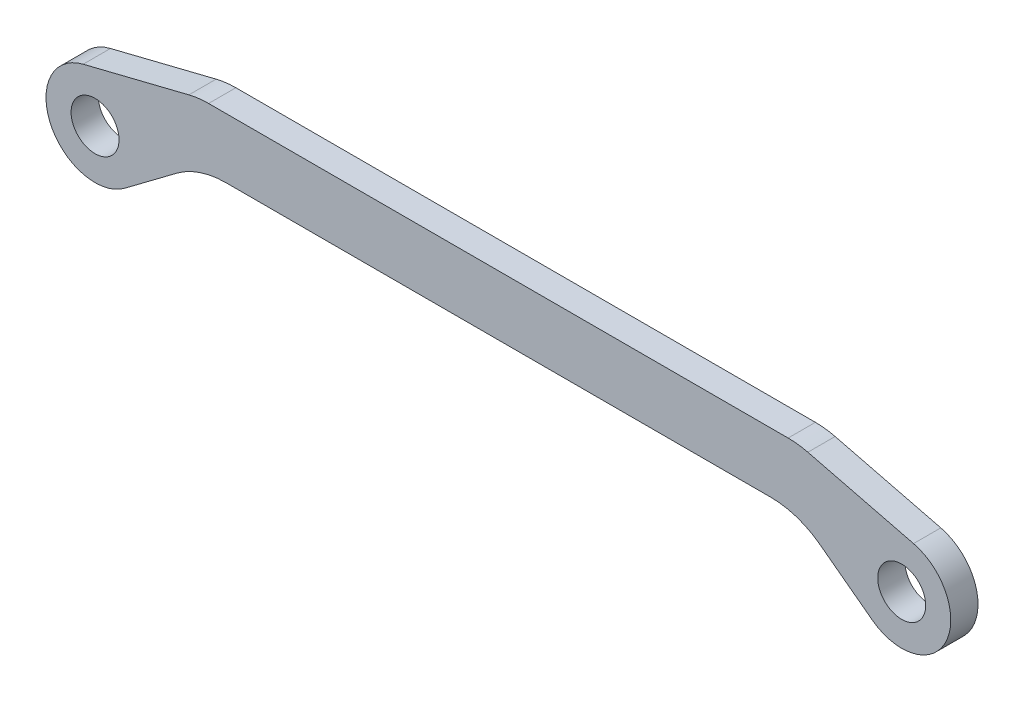
ISO-10303-21;
HEADER;
FILE_DESCRIPTION(('STEP AP214'),'2;1');
FILE_NAME('part.step','',(''),(''),'','','');
FILE_SCHEMA(('AUTOMOTIVE_DESIGN { 1 0 10303 214 1 1 1 1 }'));
ENDSEC;
DATA;
#1=APPLICATION_CONTEXT('core data for automotive mechanical design processes');
#2=APPLICATION_PROTOCOL_DEFINITION('international standard','automotive_design',2000,#1);
#3=PRODUCT_CONTEXT('',#1,'mechanical');
#4=PRODUCT('Part','Part','',(#3));
#5=PRODUCT_RELATED_PRODUCT_CATEGORY('part','',(#4));
#6=PRODUCT_DEFINITION_FORMATION('','',#4);
#7=PRODUCT_DEFINITION_CONTEXT('part definition',#1,'design');
#8=PRODUCT_DEFINITION('design','',#6,#7);
#9=PRODUCT_DEFINITION_SHAPE('','',#8);
#10=(LENGTH_UNIT() NAMED_UNIT(*) SI_UNIT(.MILLI.,.METRE.));
#11=(NAMED_UNIT(*) PLANE_ANGLE_UNIT() SI_UNIT($,.RADIAN.));
#12=(NAMED_UNIT(*) SI_UNIT($,.STERADIAN.) SOLID_ANGLE_UNIT());
#13=UNCERTAINTY_MEASURE_WITH_UNIT(LENGTH_MEASURE(1.E-05),#10,'distance_accuracy_value','');
#14=(GEOMETRIC_REPRESENTATION_CONTEXT(3) GLOBAL_UNCERTAINTY_ASSIGNED_CONTEXT((#13)) GLOBAL_UNIT_ASSIGNED_CONTEXT((#10,
#11,#12)) REPRESENTATION_CONTEXT('',''));
#15=CARTESIAN_POINT('',(0.,0.,0.));
#16=DIRECTION('',(0.,0.,1.));
#17=DIRECTION('',(1.,0.,0.));
#18=AXIS2_PLACEMENT_3D('',#15,#16,#17);
#19=CARTESIAN_POINT('',(0.,0.,5.));
#20=DIRECTION('',(0.,0.,1.));
#21=DIRECTION('',(1.,0.,0.));
#22=AXIS2_PLACEMENT_3D('',#19,#20,#21);
#23=PLANE('',#22);
#24=DIRECTION('',(-0.800000000000001,0.599999999999999,0.));
#25=VECTOR('',#24,1.);
#26=CARTESIAN_POINT('',(-19.,2.99999999999998,5.));
#27=LINE('',#26,#25);
#28=CARTESIAN_POINT('',(-15.,0.,5.));
#29=VERTEX_POINT('',#28);
#30=CARTESIAN_POINT('',(-5.39999999999999,-7.2,5.));
#31=VERTEX_POINT('',#30);
#32=EDGE_CURVE('E138',#29,#31,#27,.F.);
#33=ORIENTED_EDGE('',*,*,#32,.T.);
#34=CARTESIAN_POINT('',(0.,0.,5.));
#35=DIRECTION('',(0.,0.,-1.));
#36=DIRECTION('',(-1.,0.,0.));
#37=AXIS2_PLACEMENT_3D('',#34,#35,#36);
#38=CIRCLE('',#37,9.);
#39=CARTESIAN_POINT('',(2.17234372152279,8.73389505063809,5.));
#40=VERTEX_POINT('',#39);
#41=EDGE_CURVE('E140',#40,#31,#38,.T.);
#42=ORIENTED_EDGE('',*,*,#41,.F.);
#43=DIRECTION('',(0.970432783404232,-0.241371524613644,0.));
#44=VECTOR('',#43,1.);
#45=CARTESIAN_POINT('',(-19.,14.,5.));
#46=LINE('',#45,#44);
#47=CARTESIAN_POINT('',(-17.2168777151028,13.5564917510635,5.));
#48=VERTEX_POINT('',#47);
#49=EDGE_CURVE('E133',#40,#48,#46,.F.);
#50=ORIENTED_EDGE('',*,*,#49,.T.);
#51=CARTESIAN_POINT('',(-20.8374505843074,-1.00000000000002,5.));
#52=DIRECTION('',(0.,0.,-1.));
#53=DIRECTION('',(-1.,0.,0.));
#54=AXIS2_PLACEMENT_3D('',#51,#52,#53);
#55=CIRCLE('',#54,15.);
#56=CARTESIAN_POINT('',(-20.8374505843074,14.,5.));
#57=VERTEX_POINT('',#56);
#58=EDGE_CURVE('E136',#57,#48,#55,.T.);
#59=ORIENTED_EDGE('',*,*,#58,.F.);
#60=DIRECTION('',(1.,0.,0.));
#61=VECTOR('',#60,1.);
#62=CARTESIAN_POINT('',(-129.,14.,5.));
#63=LINE('',#62,#61);
#64=CARTESIAN_POINT('',(-127.162549415693,14.,5.));
#65=VERTEX_POINT('',#64);
#66=EDGE_CURVE('E110',#57,#65,#63,.F.);
#67=ORIENTED_EDGE('',*,*,#66,.T.);
#68=CARTESIAN_POINT('',(-127.162549415693,-1.00000000000002,5.));
#69=DIRECTION('',(0.,0.,-1.));
#70=DIRECTION('',(-1.,0.,0.));
#71=AXIS2_PLACEMENT_3D('',#68,#69,#70);
#72=CIRCLE('',#71,15.);
#73=CARTESIAN_POINT('',(-130.783122284897,13.5564917510635,5.));
#74=VERTEX_POINT('',#73);
#75=EDGE_CURVE('E104',#74,#65,#72,.T.);
#76=ORIENTED_EDGE('',*,*,#75,.F.);
#77=DIRECTION('',(0.970432783404232,0.241371524613645,0.));
#78=VECTOR('',#77,1.);
#79=CARTESIAN_POINT('',(-150.172343721523,8.73389505063807,5.));
#80=LINE('',#79,#78);
#81=CARTESIAN_POINT('',(-150.172343721523,8.73389505063807,5.));
#82=VERTEX_POINT('',#81);
#83=EDGE_CURVE('E108',#74,#82,#80,.F.);
#84=ORIENTED_EDGE('',*,*,#83,.T.);
#85=CARTESIAN_POINT('',(-148.,0.,5.));
#86=DIRECTION('',(0.,0.,-1.));
#87=DIRECTION('',(-1.,0.,0.));
#88=AXIS2_PLACEMENT_3D('',#85,#86,#87);
#89=CIRCLE('',#88,8.99999999999998);
#90=CARTESIAN_POINT('',(-142.6,-7.2,5.));
#91=VERTEX_POINT('',#90);
#92=EDGE_CURVE('E182',#91,#82,#89,.T.);
#93=ORIENTED_EDGE('',*,*,#92,.F.);
#94=DIRECTION('',(-0.8,-0.6,0.));
#95=VECTOR('',#94,1.);
#96=CARTESIAN_POINT('',(-142.6,-7.20000000000001,5.));
#97=LINE('',#96,#95);
#98=CARTESIAN_POINT('',(-133.,0.,5.));
#99=VERTEX_POINT('',#98);
#100=EDGE_CURVE('E146',#91,#99,#97,.F.);
#101=ORIENTED_EDGE('',*,*,#100,.T.);
#102=CARTESIAN_POINT('',(-124.,-12.,5.));
#103=DIRECTION('',(0.,0.,1.));
#104=DIRECTION('',(1.,0.,0.));
#105=AXIS2_PLACEMENT_3D('',#102,#103,#104);
#106=CIRCLE('',#105,15.);
#107=CARTESIAN_POINT('',(-124.,2.99999999999998,5.));
#108=VERTEX_POINT('',#107);
#109=EDGE_CURVE('E180',#99,#108,#106,.F.);
#110=ORIENTED_EDGE('',*,*,#109,.T.);
#111=DIRECTION('',(1.,0.,0.));
#112=VECTOR('',#111,1.);
#113=CARTESIAN_POINT('',(-129.,2.99999999999998,5.));
#114=LINE('',#113,#112);
#115=CARTESIAN_POINT('',(-24.,2.99999999999999,5.));
#116=VERTEX_POINT('',#115);
#117=EDGE_CURVE('E142',#108,#116,#114,.T.);
#118=ORIENTED_EDGE('',*,*,#117,.T.);
#119=CARTESIAN_POINT('',(-24.,-12.,5.));
#120=DIRECTION('',(0.,0.,1.));
#121=DIRECTION('',(1.,0.,0.));
#122=AXIS2_PLACEMENT_3D('',#119,#120,#121);
#123=CIRCLE('',#122,15.);
#124=EDGE_CURVE('E178',#116,#29,#123,.F.);
#125=ORIENTED_EDGE('',*,*,#124,.T.);
#126=EDGE_LOOP('',(#33,#42,#50,#59,#67,#76,#84,#93,#101,#110,#118,#125));
#127=FACE_BOUND('',#126,.T.);
#128=CARTESIAN_POINT('',(-148.,0.,5.));
#129=DIRECTION('',(0.,0.,1.));
#130=DIRECTION('',(1.,0.,0.));
#131=AXIS2_PLACEMENT_3D('',#128,#129,#130);
#132=CIRCLE('',#131,4.39999999999999);
#133=CARTESIAN_POINT('',(-143.6,0.,5.));
#134=VERTEX_POINT('',#133);
#135=EDGE_CURVE('E116',#134,#134,#132,.F.);
#136=ORIENTED_EDGE('',*,*,#135,.T.);
#137=EDGE_LOOP('',(#136));
#138=FACE_BOUND('',#137,.T.);
#139=CARTESIAN_POINT('',(0.,0.,5.));
#140=DIRECTION('',(0.,0.,1.));
#141=DIRECTION('',(1.,0.,0.));
#142=AXIS2_PLACEMENT_3D('',#139,#140,#141);
#143=CIRCLE('',#142,4.4);
#144=CARTESIAN_POINT('',(4.4,0.,5.));
#145=VERTEX_POINT('',#144);
#146=EDGE_CURVE('E20',#145,#145,#143,.F.);
#147=ORIENTED_EDGE('',*,*,#146,.T.);
#148=EDGE_LOOP('',(#147));
#149=FACE_BOUND('',#148,.T.);
#150=ADVANCED_FACE('F17',(#127,#138,#149),#23,.T.);
#151=CARTESIAN_POINT('',(0.,0.,-2.));
#152=DIRECTION('',(0.,0.,1.));
#153=DIRECTION('',(1.,0.,0.));
#154=AXIS2_PLACEMENT_3D('',#151,#152,#153);
#155=CYLINDRICAL_SURFACE('',#154,4.4);
#156=CARTESIAN_POINT('',(0.,0.,0.));
#157=DIRECTION('',(0.,0.,1.));
#158=DIRECTION('',(1.,0.,0.));
#159=AXIS2_PLACEMENT_3D('',#156,#157,#158);
#160=CIRCLE('',#159,4.4);
#161=CARTESIAN_POINT('',(4.4,0.,0.));
#162=VERTEX_POINT('',#161);
#163=EDGE_CURVE('E132',#162,#162,#160,.F.);
#164=ORIENTED_EDGE('',*,*,#163,.T.);
#165=EDGE_LOOP('',(#164));
#166=FACE_BOUND('',#165,.T.);
#167=ORIENTED_EDGE('',*,*,#146,.F.);
#168=EDGE_LOOP('',(#167));
#169=FACE_BOUND('',#168,.T.);
#170=ADVANCED_FACE('F189',(#166,#169),#155,.F.);
#171=CARTESIAN_POINT('',(-148.,0.,-2.));
#172=DIRECTION('',(0.,0.,1.));
#173=DIRECTION('',(1.,0.,0.));
#174=AXIS2_PLACEMENT_3D('',#171,#172,#173);
#175=CYLINDRICAL_SURFACE('',#174,4.39999999999999);
#176=CARTESIAN_POINT('',(-148.,0.,0.));
#177=DIRECTION('',(0.,0.,1.));
#178=DIRECTION('',(1.,0.,0.));
#179=AXIS2_PLACEMENT_3D('',#176,#177,#178);
#180=CIRCLE('',#179,4.39999999999999);
#181=CARTESIAN_POINT('',(-143.6,0.,0.));
#182=VERTEX_POINT('',#181);
#183=EDGE_CURVE('E169',#182,#182,#180,.F.);
#184=ORIENTED_EDGE('',*,*,#183,.T.);
#185=EDGE_LOOP('',(#184));
#186=FACE_BOUND('',#185,.T.);
#187=ORIENTED_EDGE('',*,*,#135,.F.);
#188=EDGE_LOOP('',(#187));
#189=FACE_BOUND('',#188,.T.);
#190=ADVANCED_FACE('F191',(#186,#189),#175,.F.);
#191=CARTESIAN_POINT('',(-127.162549415693,-1.00000000000002,5.));
#192=DIRECTION('',(0.,0.,-1.));
#193=DIRECTION('',(-1.,0.,0.));
#194=AXIS2_PLACEMENT_3D('',#191,#192,#193);
#195=CYLINDRICAL_SURFACE('',#194,15.);
#196=CARTESIAN_POINT('',(-127.162549415693,-1.00000000000002,0.));
#197=DIRECTION('',(0.,0.,-1.));
#198=DIRECTION('',(-1.,0.,0.));
#199=AXIS2_PLACEMENT_3D('',#196,#197,#198);
#200=CIRCLE('',#199,15.);
#201=CARTESIAN_POINT('',(-127.162549415693,14.,0.));
#202=VERTEX_POINT('',#201);
#203=CARTESIAN_POINT('',(-130.783122284897,13.5564917510635,0.));
#204=VERTEX_POINT('',#203);
#205=EDGE_CURVE('E126',#202,#204,#200,.F.);
#206=ORIENTED_EDGE('',*,*,#205,.T.);
#207=DIRECTION('',(0.,0.,1.));
#208=VECTOR('',#207,1.);
#209=CARTESIAN_POINT('',(-130.783122284897,13.5564917510635,5.));
#210=LINE('',#209,#208);
#211=EDGE_CURVE('E115',#204,#74,#210,.T.);
#212=ORIENTED_EDGE('',*,*,#211,.T.);
#213=ORIENTED_EDGE('',*,*,#75,.T.);
#214=DIRECTION('',(0.,0.,1.));
#215=VECTOR('',#214,1.);
#216=CARTESIAN_POINT('',(-127.162549415693,14.,5.));
#217=LINE('',#216,#215);
#218=EDGE_CURVE('E365',#65,#202,#217,.F.);
#219=ORIENTED_EDGE('',*,*,#218,.T.);
#220=EDGE_LOOP('',(#206,#212,#213,#219));
#221=FACE_BOUND('',#220,.T.);
#222=ADVANCED_FACE('F125',(#221),#195,.T.);
#223=CARTESIAN_POINT('',(-150.172343721523,8.73389505063807,5.));
#224=DIRECTION('',(0.241371524613645,-0.970432783404232,0.));
#225=DIRECTION('',(0.970432783404232,0.241371524613645,0.));
#226=AXIS2_PLACEMENT_3D('',#223,#224,#225);
#227=PLANE('',#226);
#228=ORIENTED_EDGE('',*,*,#211,.F.);
#229=DIRECTION('',(-0.970432783404232,-0.241371524613645,0.));
#230=VECTOR('',#229,1.);
#231=CARTESIAN_POINT('',(-130.783122284897,13.5564917510635,0.));
#232=LINE('',#231,#230);
#233=CARTESIAN_POINT('',(-150.172343721523,8.73389505063807,0.));
#234=VERTEX_POINT('',#233);
#235=EDGE_CURVE('E167',#204,#234,#232,.T.);
#236=ORIENTED_EDGE('',*,*,#235,.T.);
#237=DIRECTION('',(0.,0.,-1.));
#238=VECTOR('',#237,1.);
#239=CARTESIAN_POINT('',(-150.172343721523,8.73389505063806,5.));
#240=LINE('',#239,#238);
#241=EDGE_CURVE('E122',#82,#234,#240,.T.);
#242=ORIENTED_EDGE('',*,*,#241,.F.);
#243=ORIENTED_EDGE('',*,*,#83,.F.);
#244=EDGE_LOOP('',(#228,#236,#242,#243));
#245=FACE_BOUND('',#244,.T.);
#246=ADVANCED_FACE('F119',(#245),#227,.F.);
#247=CARTESIAN_POINT('',(-148.,0.,5.));
#248=DIRECTION('',(0.,0.,-1.));
#249=DIRECTION('',(-1.,0.,0.));
#250=AXIS2_PLACEMENT_3D('',#247,#248,#249);
#251=CYLINDRICAL_SURFACE('',#250,8.99999999999998);
#252=CARTESIAN_POINT('',(-148.,0.,0.));
#253=DIRECTION('',(0.,0.,-1.));
#254=DIRECTION('',(-1.,0.,0.));
#255=AXIS2_PLACEMENT_3D('',#252,#253,#254);
#256=CIRCLE('',#255,8.99999999999998);
#257=CARTESIAN_POINT('',(-142.6,-7.2,0.));
#258=VERTEX_POINT('',#257);
#259=EDGE_CURVE('E165',#234,#258,#256,.F.);
#260=ORIENTED_EDGE('',*,*,#259,.T.);
#261=DIRECTION('',(0.,0.,1.));
#262=VECTOR('',#261,1.);
#263=CARTESIAN_POINT('',(-142.6,-7.20000000000001,5.));
#264=LINE('',#263,#262);
#265=EDGE_CURVE('E148',#258,#91,#264,.T.);
#266=ORIENTED_EDGE('',*,*,#265,.T.);
#267=ORIENTED_EDGE('',*,*,#92,.T.);
#268=ORIENTED_EDGE('',*,*,#241,.T.);
#269=EDGE_LOOP('',(#260,#266,#267,#268));
#270=FACE_BOUND('',#269,.T.);
#271=ADVANCED_FACE('F243',(#270),#251,.T.);
#272=CARTESIAN_POINT('',(-142.6,-7.20000000000001,5.));
#273=DIRECTION('',(-0.6,0.8,0.));
#274=DIRECTION('',(-0.8,-0.6,0.));
#275=AXIS2_PLACEMENT_3D('',#272,#273,#274);
#276=PLANE('',#275);
#277=DIRECTION('',(0.,0.,1.));
#278=VECTOR('',#277,1.);
#279=CARTESIAN_POINT('',(-133.,0.,5.));
#280=LINE('',#279,#278);
#281=CARTESIAN_POINT('',(-133.,0.,0.));
#282=VERTEX_POINT('',#281);
#283=EDGE_CURVE('E147',#282,#99,#280,.T.);
#284=ORIENTED_EDGE('',*,*,#283,.T.);
#285=ORIENTED_EDGE('',*,*,#100,.F.);
#286=ORIENTED_EDGE('',*,*,#265,.F.);
#287=DIRECTION('',(0.800000000000001,0.599999999999999,0.));
#288=VECTOR('',#287,1.);
#289=CARTESIAN_POINT('',(-142.6,-7.2,0.));
#290=LINE('',#289,#288);
#291=EDGE_CURVE('E164',#258,#282,#290,.T.);
#292=ORIENTED_EDGE('',*,*,#291,.T.);
#293=EDGE_LOOP('',(#284,#285,#286,#292));
#294=FACE_BOUND('',#293,.T.);
#295=ADVANCED_FACE('F239',(#294),#276,.F.);
#296=CARTESIAN_POINT('',(-124.,-12.,5.));
#297=DIRECTION('',(0.,0.,1.));
#298=DIRECTION('',(1.,0.,0.));
#299=AXIS2_PLACEMENT_3D('',#296,#297,#298);
#300=CYLINDRICAL_SURFACE('',#299,15.);
#301=ORIENTED_EDGE('',*,*,#283,.F.);
#302=CARTESIAN_POINT('',(-124.,-12.,0.));
#303=DIRECTION('',(0.,0.,1.));
#304=DIRECTION('',(1.,0.,0.));
#305=AXIS2_PLACEMENT_3D('',#302,#303,#304);
#306=CIRCLE('',#305,15.);
#307=CARTESIAN_POINT('',(-124.,2.99999999999998,0.));
#308=VERTEX_POINT('',#307);
#309=EDGE_CURVE('E161',#282,#308,#306,.F.);
#310=ORIENTED_EDGE('',*,*,#309,.T.);
#311=DIRECTION('',(0.,0.,1.));
#312=VECTOR('',#311,1.);
#313=CARTESIAN_POINT('',(-124.,2.99999999999998,5.));
#314=LINE('',#313,#312);
#315=EDGE_CURVE('E145',#308,#108,#314,.T.);
#316=ORIENTED_EDGE('',*,*,#315,.T.);
#317=ORIENTED_EDGE('',*,*,#109,.F.);
#318=EDGE_LOOP('',(#301,#310,#316,#317));
#319=FACE_BOUND('',#318,.T.);
#320=ADVANCED_FACE('F235',(#319),#300,.F.);
#321=CARTESIAN_POINT('',(-129.,2.99999999999998,5.));
#322=DIRECTION('',(0.,1.,0.));
#323=DIRECTION('',(0.,0.,1.));
#324=AXIS2_PLACEMENT_3D('',#321,#322,#323);
#325=PLANE('',#324);
#326=DIRECTION('',(0.,0.,1.));
#327=VECTOR('',#326,1.);
#328=CARTESIAN_POINT('',(-24.,2.99999999999999,5.));
#329=LINE('',#328,#327);
#330=CARTESIAN_POINT('',(-24.,2.99999999999999,0.));
#331=VERTEX_POINT('',#330);
#332=EDGE_CURVE('E144',#331,#116,#329,.T.);
#333=ORIENTED_EDGE('',*,*,#332,.T.);
#334=ORIENTED_EDGE('',*,*,#117,.F.);
#335=ORIENTED_EDGE('',*,*,#315,.F.);
#336=DIRECTION('',(1.,0.,0.));
#337=VECTOR('',#336,1.);
#338=CARTESIAN_POINT('',(0.,2.99999999999998,0.));
#339=LINE('',#338,#337);
#340=EDGE_CURVE('E160',#308,#331,#339,.T.);
#341=ORIENTED_EDGE('',*,*,#340,.T.);
#342=EDGE_LOOP('',(#333,#334,#335,#341));
#343=FACE_BOUND('',#342,.T.);
#344=ADVANCED_FACE('F231',(#343),#325,.F.);
#345=CARTESIAN_POINT('',(-24.,-12.,5.));
#346=DIRECTION('',(0.,0.,1.));
#347=DIRECTION('',(1.,0.,0.));
#348=AXIS2_PLACEMENT_3D('',#345,#346,#347);
#349=CYLINDRICAL_SURFACE('',#348,15.);
#350=ORIENTED_EDGE('',*,*,#332,.F.);
#351=CARTESIAN_POINT('',(-24.,-12.,0.));
#352=DIRECTION('',(0.,0.,1.));
#353=DIRECTION('',(1.,0.,0.));
#354=AXIS2_PLACEMENT_3D('',#351,#352,#353);
#355=CIRCLE('',#354,15.);
#356=CARTESIAN_POINT('',(-15.,0.,0.));
#357=VERTEX_POINT('',#356);
#358=EDGE_CURVE('E157',#331,#357,#355,.F.);
#359=ORIENTED_EDGE('',*,*,#358,.T.);
#360=DIRECTION('',(0.,0.,1.));
#361=VECTOR('',#360,1.);
#362=CARTESIAN_POINT('',(-15.,0.,5.));
#363=LINE('',#362,#361);
#364=EDGE_CURVE('E141',#357,#29,#363,.T.);
#365=ORIENTED_EDGE('',*,*,#364,.T.);
#366=ORIENTED_EDGE('',*,*,#124,.F.);
#367=EDGE_LOOP('',(#350,#359,#365,#366));
#368=FACE_BOUND('',#367,.T.);
#369=ADVANCED_FACE('F227',(#368),#349,.F.);
#370=CARTESIAN_POINT('',(-19.,2.99999999999998,5.));
#371=DIRECTION('',(0.599999999999999,0.800000000000001,0.));
#372=DIRECTION('',(-0.800000000000001,0.599999999999999,0.));
#373=AXIS2_PLACEMENT_3D('',#370,#371,#372);
#374=PLANE('',#373);
#375=ORIENTED_EDGE('',*,*,#364,.F.);
#376=DIRECTION('',(0.800000000000001,-0.599999999999999,0.));
#377=VECTOR('',#376,1.);
#378=CARTESIAN_POINT('',(-15.,0.,0.));
#379=LINE('',#378,#377);
#380=CARTESIAN_POINT('',(-5.39999999999999,-7.20000000000001,0.));
#381=VERTEX_POINT('',#380);
#382=EDGE_CURVE('E156',#357,#381,#379,.T.);
#383=ORIENTED_EDGE('',*,*,#382,.T.);
#384=DIRECTION('',(0.,0.,-1.));
#385=VECTOR('',#384,1.);
#386=CARTESIAN_POINT('',(-5.39999999999999,-7.20000000000001,5.));
#387=LINE('',#386,#385);
#388=EDGE_CURVE('E177',#31,#381,#387,.T.);
#389=ORIENTED_EDGE('',*,*,#388,.F.);
#390=ORIENTED_EDGE('',*,*,#32,.F.);
#391=EDGE_LOOP('',(#375,#383,#389,#390));
#392=FACE_BOUND('',#391,.T.);
#393=ADVANCED_FACE('F223',(#392),#374,.F.);
#394=CARTESIAN_POINT('',(0.,0.,5.));
#395=DIRECTION('',(0.,0.,-1.));
#396=DIRECTION('',(-1.,0.,0.));
#397=AXIS2_PLACEMENT_3D('',#394,#395,#396);
#398=CYLINDRICAL_SURFACE('',#397,9.);
#399=ORIENTED_EDGE('',*,*,#41,.T.);
#400=ORIENTED_EDGE('',*,*,#388,.T.);
#401=CARTESIAN_POINT('',(0.,0.,0.));
#402=DIRECTION('',(0.,0.,-1.));
#403=DIRECTION('',(-1.,0.,0.));
#404=AXIS2_PLACEMENT_3D('',#401,#402,#403);
#405=CIRCLE('',#404,9.);
#406=CARTESIAN_POINT('',(2.17234372152279,8.73389505063809,0.));
#407=VERTEX_POINT('',#406);
#408=EDGE_CURVE('E153',#381,#407,#405,.F.);
#409=ORIENTED_EDGE('',*,*,#408,.T.);
#410=DIRECTION('',(0.,0.,1.));
#411=VECTOR('',#410,1.);
#412=CARTESIAN_POINT('',(2.1723437215228,8.73389505063809,5.));
#413=LINE('',#412,#411);
#414=EDGE_CURVE('E137',#407,#40,#413,.T.);
#415=ORIENTED_EDGE('',*,*,#414,.T.);
#416=EDGE_LOOP('',(#399,#400,#409,#415));
#417=FACE_BOUND('',#416,.T.);
#418=ADVANCED_FACE('F219',(#417),#398,.T.);
#419=CARTESIAN_POINT('',(-19.,14.,5.));
#420=DIRECTION('',(-0.241371524613644,-0.970432783404232,0.));
#421=DIRECTION('',(0.970432783404232,-0.241371524613644,0.));
#422=AXIS2_PLACEMENT_3D('',#419,#420,#421);
#423=PLANE('',#422);
#424=DIRECTION('',(0.,0.,-1.));
#425=VECTOR('',#424,1.);
#426=CARTESIAN_POINT('',(-17.2168777151028,13.5564917510635,5.));
#427=LINE('',#426,#425);
#428=CARTESIAN_POINT('',(-17.2168777151028,13.5564917510635,0.));
#429=VERTEX_POINT('',#428);
#430=EDGE_CURVE('E175',#48,#429,#427,.T.);
#431=ORIENTED_EDGE('',*,*,#430,.F.);
#432=ORIENTED_EDGE('',*,*,#49,.F.);
#433=ORIENTED_EDGE('',*,*,#414,.F.);
#434=DIRECTION('',(-0.970432783404232,0.241371524613644,0.));
#435=VECTOR('',#434,1.);
#436=CARTESIAN_POINT('',(2.17234372152279,8.73389505063809,0.));
#437=LINE('',#436,#435);
#438=EDGE_CURVE('E152',#407,#429,#437,.T.);
#439=ORIENTED_EDGE('',*,*,#438,.T.);
#440=EDGE_LOOP('',(#431,#432,#433,#439));
#441=FACE_BOUND('',#440,.T.);
#442=ADVANCED_FACE('F215',(#441),#423,.F.);
#443=CARTESIAN_POINT('',(-20.8374505843074,-1.00000000000002,5.));
#444=DIRECTION('',(0.,0.,-1.));
#445=DIRECTION('',(-1.,0.,0.));
#446=AXIS2_PLACEMENT_3D('',#443,#444,#445);
#447=CYLINDRICAL_SURFACE('',#446,15.);
#448=CARTESIAN_POINT('',(-20.8374505843074,-1.00000000000002,0.));
#449=DIRECTION('',(0.,0.,-1.));
#450=DIRECTION('',(-1.,0.,0.));
#451=AXIS2_PLACEMENT_3D('',#448,#449,#450);
#452=CIRCLE('',#451,15.);
#453=CARTESIAN_POINT('',(-20.8374505843074,14.,0.));
#454=VERTEX_POINT('',#453);
#455=EDGE_CURVE('E26',#429,#454,#452,.F.);
#456=ORIENTED_EDGE('',*,*,#455,.T.);
#457=DIRECTION('',(0.,0.,1.));
#458=VECTOR('',#457,1.);
#459=CARTESIAN_POINT('',(-20.8374505843074,14.,5.));
#460=LINE('',#459,#458);
#461=EDGE_CURVE('E34',#454,#57,#460,.T.);
#462=ORIENTED_EDGE('',*,*,#461,.T.);
#463=ORIENTED_EDGE('',*,*,#58,.T.);
#464=ORIENTED_EDGE('',*,*,#430,.T.);
#465=EDGE_LOOP('',(#456,#462,#463,#464));
#466=FACE_BOUND('',#465,.T.);
#467=ADVANCED_FACE('F208',(#466),#447,.T.);
#468=CARTESIAN_POINT('',(-129.,14.,5.));
#469=DIRECTION('',(0.,-1.,0.));
#470=DIRECTION('',(1.,0.,0.));
#471=AXIS2_PLACEMENT_3D('',#468,#469,#470);
#472=PLANE('',#471);
#473=ORIENTED_EDGE('',*,*,#461,.F.);
#474=DIRECTION('',(1.,0.,0.));
#475=VECTOR('',#474,1.);
#476=CARTESIAN_POINT('',(0.,14.,0.));
#477=LINE('',#476,#475);
#478=EDGE_CURVE('E11',#454,#202,#477,.F.);
#479=ORIENTED_EDGE('',*,*,#478,.T.);
#480=ORIENTED_EDGE('',*,*,#218,.F.);
#481=ORIENTED_EDGE('',*,*,#66,.F.);
#482=EDGE_LOOP('',(#473,#479,#480,#481));
#483=FACE_BOUND('',#482,.T.);
#484=ADVANCED_FACE('F202',(#483),#472,.F.);
#485=CARTESIAN_POINT('',(0.,0.,0.));
#486=DIRECTION('',(0.,0.,1.));
#487=DIRECTION('',(1.,0.,0.));
#488=AXIS2_PLACEMENT_3D('',#485,#486,#487);
#489=PLANE('',#488);
#490=ORIENTED_EDGE('',*,*,#455,.F.);
#491=ORIENTED_EDGE('',*,*,#438,.F.);
#492=ORIENTED_EDGE('',*,*,#408,.F.);
#493=ORIENTED_EDGE('',*,*,#382,.F.);
#494=ORIENTED_EDGE('',*,*,#358,.F.);
#495=ORIENTED_EDGE('',*,*,#340,.F.);
#496=ORIENTED_EDGE('',*,*,#309,.F.);
#497=ORIENTED_EDGE('',*,*,#291,.F.);
#498=ORIENTED_EDGE('',*,*,#259,.F.);
#499=ORIENTED_EDGE('',*,*,#235,.F.);
#500=ORIENTED_EDGE('',*,*,#205,.F.);
#501=ORIENTED_EDGE('',*,*,#478,.F.);
#502=EDGE_LOOP('',(#490,#491,#492,#493,#494,#495,#496,#497,#498,#499,#500,#501));
#503=FACE_BOUND('',#502,.T.);
#504=ORIENTED_EDGE('',*,*,#183,.F.);
#505=EDGE_LOOP('',(#504));
#506=FACE_BOUND('',#505,.T.);
#507=ORIENTED_EDGE('',*,*,#163,.F.);
#508=EDGE_LOOP('',(#507));
#509=FACE_BOUND('',#508,.T.);
#510=ADVANCED_FACE('F200',(#503,#506,#509),#489,.F.);
#511=CLOSED_SHELL('',(#150,#170,#190,#222,#246,#271,#295,#320,#344,#369,#393,#418,#442,#467,
#484,#510));
#512=MANIFOLD_SOLID_BREP('B1',#511);
#513=ADVANCED_BREP_SHAPE_REPRESENTATION('',(#18,#512),#14);
#514=SHAPE_DEFINITION_REPRESENTATION(#9,#513);
ENDSEC;
END-ISO-10303-21;
